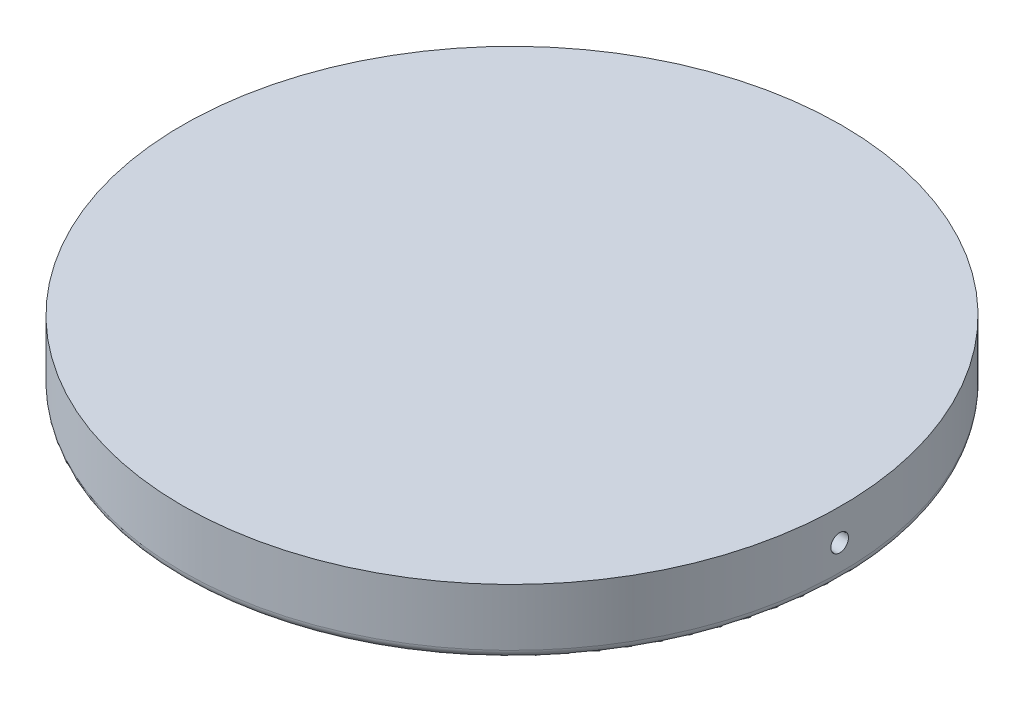
ISO-10303-21;
HEADER;
FILE_DESCRIPTION(('STEP AP214'),'2;1');
FILE_NAME('part.step','',(''),(''),'','','');
FILE_SCHEMA(('AUTOMOTIVE_DESIGN { 1 0 10303 214 1 1 1 1 }'));
ENDSEC;
DATA;
#1=APPLICATION_CONTEXT('core data for automotive mechanical design processes');
#2=APPLICATION_PROTOCOL_DEFINITION('international standard','automotive_design',2000,#1);
#3=PRODUCT_CONTEXT('',#1,'mechanical');
#4=PRODUCT('Part','Part','',(#3));
#5=PRODUCT_RELATED_PRODUCT_CATEGORY('part','',(#4));
#6=PRODUCT_DEFINITION_FORMATION('','',#4);
#7=PRODUCT_DEFINITION_CONTEXT('part definition',#1,'design');
#8=PRODUCT_DEFINITION('design','',#6,#7);
#9=PRODUCT_DEFINITION_SHAPE('','',#8);
#10=(LENGTH_UNIT() NAMED_UNIT(*) SI_UNIT(.MILLI.,.METRE.));
#11=(NAMED_UNIT(*) PLANE_ANGLE_UNIT() SI_UNIT($,.RADIAN.));
#12=(NAMED_UNIT(*) SI_UNIT($,.STERADIAN.) SOLID_ANGLE_UNIT());
#13=UNCERTAINTY_MEASURE_WITH_UNIT(LENGTH_MEASURE(1.E-05),#10,'distance_accuracy_value','');
#14=(GEOMETRIC_REPRESENTATION_CONTEXT(3) GLOBAL_UNCERTAINTY_ASSIGNED_CONTEXT((#13)) GLOBAL_UNIT_ASSIGNED_CONTEXT((#10,
#11,#12)) REPRESENTATION_CONTEXT('',''));
#15=CARTESIAN_POINT('',(0.,0.,0.));
#16=DIRECTION('',(0.,0.,1.));
#17=DIRECTION('',(1.,0.,0.));
#18=AXIS2_PLACEMENT_3D('',#15,#16,#17);
#19=CARTESIAN_POINT('',(0.,15.,0.));
#20=DIRECTION('',(0.,-1.,0.));
#21=DIRECTION('',(0.,0.,-1.));
#22=AXIS2_PLACEMENT_3D('',#19,#20,#21);
#23=CYLINDRICAL_SURFACE('',#22,75.);
#24=CARTESIAN_POINT('',(0.,2.,0.));
#25=DIRECTION('',(0.,1.,0.));
#26=DIRECTION('',(0.,0.,1.));
#27=AXIS2_PLACEMENT_3D('',#24,#25,#26);
#28=CIRCLE('',#27,75.);
#29=CARTESIAN_POINT('',(0.,2.,75.));
#30=VERTEX_POINT('',#29);
#31=EDGE_CURVE('E66',#30,#30,#28,.T.);
#32=ORIENTED_EDGE('',*,*,#31,.T.);
#33=EDGE_LOOP('',(#32));
#34=FACE_BOUND('',#33,.T.);
#35=CARTESIAN_POINT('',(0.,15.,0.));
#36=DIRECTION('',(0.,1.,0.));
#37=DIRECTION('',(0.,0.,1.));
#38=AXIS2_PLACEMENT_3D('',#35,#36,#37);
#39=CIRCLE('',#38,75.);
#40=CARTESIAN_POINT('',(0.,15.,75.));
#41=VERTEX_POINT('',#40);
#42=EDGE_CURVE('E70',#41,#41,#39,.T.);
#43=ORIENTED_EDGE('',*,*,#42,.F.);
#44=EDGE_LOOP('',(#43));
#45=FACE_BOUND('',#44,.T.);
#46=CARTESIAN_POINT('',(74.9831143951382,7.90789250676341,-1.59140051703598));
#47=CARTESIAN_POINT('',(74.9831147576543,7.79521916518556,-1.59139466791111));
#48=CARTESIAN_POINT('',(74.983328482943,7.68247068537999,-1.58140564600523));
#49=CARTESIAN_POINT('',(74.9841360050816,7.46009194389446,-1.54262939724804));
#50=CARTESIAN_POINT('',(74.9847306369029,7.35046908655241,-1.51380087018871));
#51=CARTESIAN_POINT('',(74.9862127342194,7.13765347230673,-1.43851083163473));
#52=CARTESIAN_POINT('',(74.9870997526245,7.03445118232228,-1.39207622550786));
#53=CARTESIAN_POINT('',(74.9890493096721,6.83722921802696,-1.28275320415097));
#54=CARTESIAN_POINT('',(74.9901116483274,6.7431992730925,-1.21988348921332));
#55=CARTESIAN_POINT('',(74.9917346259016,6.61082997971371,-1.11399975302977));
#56=CARTESIAN_POINT('',(74.9922835055482,6.5679499525103,-1.07654648616189));
#57=CARTESIAN_POINT('',(74.9933698584418,6.48565496548844,-0.998010088676955));
#58=CARTESIAN_POINT('',(74.9939073318845,6.44623994618797,-0.956927020395126));
#59=CARTESIAN_POINT('',(74.9954698181209,6.33359347224185,-0.828718436419516));
#60=CARTESIAN_POINT('',(74.9964454288939,6.26591982700484,-0.736600827543206));
#61=CARTESIAN_POINT('',(74.9980774957948,6.14880930626225,-0.545233552146375));
#62=CARTESIAN_POINT('',(74.9987424164279,6.09889886971792,-0.446269589959552));
#63=CARTESIAN_POINT('',(74.9996807778869,6.0156717181506,-0.241508875695325));
#64=CARTESIAN_POINT('',(74.9999542116772,5.98235530135209,-0.135712000856748));
#65=CARTESIAN_POINT('',(75.0000158065511,5.94523967379934,0.0278539429988439));
#66=CARTESIAN_POINT('',(74.9999742127198,5.93495184788642,0.0842251192138417));
#67=CARTESIAN_POINT('',(74.999760926659,5.91927475136253,0.197658043338545));
#68=CARTESIAN_POINT('',(74.999589242232,5.91388518700572,0.254719749629584));
#69=CARTESIAN_POINT('',(74.9991137135043,5.90816539050011,0.369068351974056));
#70=CARTESIAN_POINT('',(74.9988099338241,5.90783268740357,0.426355124363829));
#71=CARTESIAN_POINT('',(74.9980725555395,5.91232099065492,0.540724744146702));
#72=CARTESIAN_POINT('',(74.9976389568968,5.91714199851766,0.597807591479856));
#73=CARTESIAN_POINT('',(74.99666777867,5.93142710389621,0.709078807585716));
#74=CARTESIAN_POINT('',(74.9961350148963,5.94069911350285,0.763292067609994));
#75=CARTESIAN_POINT('',(74.9949642112914,5.96363301307494,0.870768188352102));
#76=CARTESIAN_POINT('',(74.9943261708259,5.97729492949399,0.924031043340743));
#77=CARTESIAN_POINT('',(74.9922685965265,6.02465904967286,1.08199146030498));
#78=CARTESIAN_POINT('',(74.9907057949738,6.06473689664067,1.18484024951517));
#79=CARTESIAN_POINT('',(74.9872454913968,6.16279166318149,1.38695776994992));
#80=CARTESIAN_POINT('',(74.9853368115797,6.22144089637036,1.48590202147196));
#81=CARTESIAN_POINT('',(74.9823955672594,6.32134354121091,1.62558952143614));
#82=CARTESIAN_POINT('',(74.9814022307797,6.35662793201931,1.67069264188256));
#83=CARTESIAN_POINT('',(74.9794153082377,6.43106293474174,1.75760183706779));
#84=CARTESIAN_POINT('',(74.9784217222198,6.47021308200043,1.79940830697281));
#85=CARTESIAN_POINT('',(74.9764843922621,6.55110611864288,1.87838082824168));
#86=CARTESIAN_POINT('',(74.9755400240782,6.59276346258194,1.91563462019306));
#87=CARTESIAN_POINT('',(74.9736964450613,6.6790723142962,1.98647792600494));
#88=CARTESIAN_POINT('',(74.9727972387116,6.72372411832004,2.02006707644819));
#89=CARTESIAN_POINT('',(74.9701961990559,6.86174612540728,2.11511599510396));
#90=CARTESIAN_POINT('',(74.9685913947912,6.95916459555522,2.17083948159847));
#91=CARTESIAN_POINT('',(74.9657824049821,7.16213110729992,2.26577559714169));
#92=CARTESIAN_POINT('',(74.9645798390776,7.26770995711312,2.30492164027878));
#93=CARTESIAN_POINT('',(74.962701936352,7.48388455409536,2.36521533862953));
#94=CARTESIAN_POINT('',(74.9620261175727,7.59447561694823,2.38637944838652));
#95=CARTESIAN_POINT('',(74.9614646972175,7.76247420587601,2.40391963993));
#96=CARTESIAN_POINT('',(74.9613537626695,7.81921631475054,2.40737271428294));
#97=CARTESIAN_POINT('',(74.9612925899244,7.9327846811812,2.40927660297843));
#98=CARTESIAN_POINT('',(74.9613423501533,7.98961093790766,2.40772746631678));
#99=CARTESIAN_POINT('',(74.9617298577958,8.15959118774304,2.39565377643201));
#100=CARTESIAN_POINT('',(74.9623056707446,8.27229570597341,2.3777079770352));
#101=CARTESIAN_POINT('',(74.9639912809839,8.48996794216443,2.32393898563499));
#102=CARTESIAN_POINT('',(74.9650859881375,8.59506310774587,2.28861999657931));
#103=CARTESIAN_POINT('',(74.9676947660443,8.79817239115623,2.20150865619064));
#104=CARTESIAN_POINT('',(74.9692088087083,8.89618698272447,2.14971740822055));
#105=CARTESIAN_POINT('',(74.9725853196906,9.08587047090947,2.02860488724229));
#106=CARTESIAN_POINT('',(74.9744583796202,9.17718330816714,1.95871905019558));
#107=CARTESIAN_POINT('',(74.977368186527,9.30377667508201,1.84275616601305));
#108=CARTESIAN_POINT('',(74.9783551163882,9.34425506306357,1.8022332316165));
#109=CARTESIAN_POINT('',(74.9803379140477,9.42146802076021,1.71776458196401));
#110=CARTESIAN_POINT('',(74.9813337821145,9.45820247758682,1.67381876357037));
#111=CARTESIAN_POINT('',(74.9842234660465,9.55999259097211,1.5407395596234));
#112=CARTESIAN_POINT('',(74.9860941996191,9.61974753419125,1.44746979816985));
#113=CARTESIAN_POINT('',(74.9896047509125,9.72339462416106,1.25247914933051));
#114=CARTESIAN_POINT('',(74.9912443876386,9.76727437915837,1.1507517359644));
#115=CARTESIAN_POINT('',(74.9942106311693,9.83919930992078,0.938098032729597));
#116=CARTESIAN_POINT('',(74.9955252989283,9.86668201295023,0.826980021895059));
#117=CARTESIAN_POINT('',(74.9976702921944,9.90223378563753,0.601752425975222));
#118=CARTESIAN_POINT('',(74.9985011249548,9.9103232150672,0.487646105509598));
#119=CARTESIAN_POINT('',(74.9996254092866,9.90628691578862,0.262047774392684));
#120=CARTESIAN_POINT('',(74.9999291063343,9.89455555710124,0.150548476561483));
#121=CARTESIAN_POINT('',(75.0000487449079,9.8527149445081,-0.0690336709074058));
#122=CARTESIAN_POINT('',(74.999864147847,9.82258542568126,-0.177112614880283));
#123=CARTESIAN_POINT('',(74.9990741817348,9.74497431418019,-0.387245602609833));
#124=CARTESIAN_POINT('',(74.9984673839307,9.69743406204487,-0.489277908092074));
#125=CARTESIAN_POINT('',(74.9969433245988,9.58619337722495,-0.684078985812986));
#126=CARTESIAN_POINT('',(74.9960263661833,9.52250873721445,-0.776856688152749));
#127=CARTESIAN_POINT('',(74.9945222214621,9.41541152310366,-0.907518845357272));
#128=CARTESIAN_POINT('',(74.9939946987921,9.37743706677829,-0.949955885381645));
#129=CARTESIAN_POINT('',(74.9929203438117,9.29784624228071,-1.03128514301814));
#130=CARTESIAN_POINT('',(74.9923735121635,9.25622999891544,-1.07017748201681));
#131=CARTESIAN_POINT('',(74.9912812257116,9.16970452100679,-1.14416473967788));
#132=CARTESIAN_POINT('',(74.9907357721324,9.12479301268932,-1.17925699410042));
#133=CARTESIAN_POINT('',(74.9896652441197,9.03214730597989,-1.24547206417618));
#134=CARTESIAN_POINT('',(74.9891401710155,8.98441292398737,-1.27659462122255));
#135=CARTESIAN_POINT('',(74.9876558393263,8.84080771558441,-1.36185357267257));
#136=CARTESIAN_POINT('',(74.9867481075519,8.74154419629546,-1.4103988564265));
#137=CARTESIAN_POINT('',(74.9851886679165,8.5366833272145,-1.49101110988702));
#138=CARTESIAN_POINT('',(74.9845366600505,8.43109356784401,-1.52309740231075));
#139=CARTESIAN_POINT('',(74.9837503526066,8.25538021695473,-1.56121412185315));
#140=CARTESIAN_POINT('',(74.9835139710236,8.18636108752459,-1.57247912415924));
#141=CARTESIAN_POINT('',(74.9831959111005,8.04753487681907,-1.58757263675666));
#142=CARTESIAN_POINT('',(74.9831141704485,7.97772812432422,-1.5914041423589));
#143=CARTESIAN_POINT('',(74.9831143951382,7.90789250676341,-1.59140051703598));
#144=B_SPLINE_CURVE_WITH_KNOTS('',3,(#46,#47,#48,#49,#50,#51,#52,#53,#54,#55,#56,#57,#58,#59,
#60,#61,#62,#63,#64,#65,#66,#67,#68,#69,#70,#71,#72,#73,#74,#75,#76,#77,#78,#79,#80,#81,#82,#83,
#84,#85,#86,#87,#88,#89,#90,#91,#92,#93,#94,#95,#96,#97,#98,#99,#100,#101,#102,#103,#104,#105,
#106,#107,#108,#109,#110,#111,#112,#113,#114,#115,#116,#117,#118,#119,#120,#121,#122,#123,#124,
#125,#126,#127,#128,#129,#130,#131,#132,#133,#134,#135,#136,#137,#138,#139,#140,#141,#142,#143),
.UNSPECIFIED.,.T.,.F.,(4,2,2,2,2,2,2,2,2,2,2,2,2,2,2,2,2,2,2,2,2,2,2,2,2,2,2,2,2,2,2,2,2,2,2,2,
2,2,2,2,2,2,2,2,2,2,2,2,4),(0.,0.337768211448335,0.676279377957609,1.01427530784169,
1.35188831856574,1.5225050562389,1.69311886444979,2.03419181146603,2.36533529515297,
2.69648472987121,2.86821587287864,3.03993671659131,3.21157364918581,3.38321063222999,
3.548028200412,3.71284676180441,4.04254556642816,4.38589353607552,4.55752904764824,
4.72914395406915,4.89661063029596,5.0640938988872,5.39913603253197,5.73551143658421,
6.07157870452216,6.24192959954549,6.41227882601608,6.75283140913283,7.08403679307709,
7.41521999653023,7.75834030611736,7.92999694803696,8.10165876428434,8.43239705349709,
8.76339295411558,9.10517280205719,9.44659367951273,9.78130107794364,10.1163778113822,
10.4525940149473,10.7884825875816,10.9591439714201,11.1297995088461,11.3005739286542,
11.4713594679244,11.8013474141834,12.130947065604,12.3403822518747,12.5497330291622),.UNSPECIFIED.);
#145=CARTESIAN_POINT('',(74.9831143951382,7.90789250676341,-1.59140051703598));
#146=VERTEX_POINT('',#145);
#147=EDGE_CURVE('E45',#146,#146,#144,.F.);
#148=ORIENTED_EDGE('',*,*,#147,.F.);
#149=EDGE_LOOP('',(#148));
#150=FACE_BOUND('',#149,.T.);
#151=ADVANCED_FACE('F40',(#34,#45,#150),#23,.T.);
#152=CARTESIAN_POINT('',(0.,15.,0.));
#153=DIRECTION('',(0.,1.,0.));
#154=DIRECTION('',(0.,0.,1.));
#155=AXIS2_PLACEMENT_3D('',#152,#153,#154);
#156=PLANE('',#155);
#157=ORIENTED_EDGE('',*,*,#42,.T.);
#158=EDGE_LOOP('',(#157));
#159=FACE_BOUND('',#158,.T.);
#160=ADVANCED_FACE('F130',(#159),#156,.T.);
#161=CARTESIAN_POINT('',(0.,0.,0.));
#162=DIRECTION('',(0.,1.,0.));
#163=DIRECTION('',(0.,0.,1.));
#164=AXIS2_PLACEMENT_3D('',#161,#162,#163);
#165=PLANE('',#164);
#166=CARTESIAN_POINT('',(30.,0.,0.));
#167=DIRECTION('',(0.,-1.,0.));
#168=DIRECTION('',(0.,0.,-1.));
#169=AXIS2_PLACEMENT_3D('',#166,#167,#168);
#170=CIRCLE('',#169,6.5);
#171=CARTESIAN_POINT('',(30.,0.,-6.5));
#172=VERTEX_POINT('',#171);
#173=EDGE_CURVE('E79',#172,#172,#170,.T.);
#174=ORIENTED_EDGE('',*,*,#173,.F.);
#175=EDGE_LOOP('',(#174));
#176=FACE_BOUND('',#175,.T.);
#177=CARTESIAN_POINT('',(-35.,0.,0.));
#178=DIRECTION('',(0.,1.,0.));
#179=DIRECTION('',(0.,0.,1.));
#180=AXIS2_PLACEMENT_3D('',#177,#178,#179);
#181=CIRCLE('',#180,11.);
#182=CARTESIAN_POINT('',(-35.,0.,11.));
#183=VERTEX_POINT('',#182);
#184=EDGE_CURVE('E55',#183,#183,#181,.T.);
#185=ORIENTED_EDGE('',*,*,#184,.T.);
#186=EDGE_LOOP('',(#185));
#187=FACE_BOUND('',#186,.T.);
#188=CARTESIAN_POINT('',(0.,0.,0.));
#189=DIRECTION('',(0.,1.,0.));
#190=DIRECTION('',(0.,0.,1.));
#191=AXIS2_PLACEMENT_3D('',#188,#189,#190);
#192=CIRCLE('',#191,73.);
#193=CARTESIAN_POINT('',(0.,0.,73.));
#194=VERTEX_POINT('',#193);
#195=EDGE_CURVE('E60',#194,#194,#192,.F.);
#196=ORIENTED_EDGE('',*,*,#195,.T.);
#197=EDGE_LOOP('',(#196));
#198=FACE_BOUND('',#197,.T.);
#199=ADVANCED_FACE('F125',(#176,#187,#198),#165,.F.);
#200=CARTESIAN_POINT('',(-35.,43.2842712474619,0.));
#201=DIRECTION('',(0.,-1.,0.));
#202=DIRECTION('',(0.,0.,-1.));
#203=AXIS2_PLACEMENT_3D('',#200,#201,#202);
#204=CYLINDRICAL_SURFACE('',#203,10.);
#205=CARTESIAN_POINT('',(-35.,0.999999999999973,0.));
#206=DIRECTION('',(0.,1.,0.));
#207=DIRECTION('',(0.,0.,1.));
#208=AXIS2_PLACEMENT_3D('',#205,#206,#207);
#209=CIRCLE('',#208,10.);
#210=CARTESIAN_POINT('',(-35.,0.999999999999973,10.));
#211=VERTEX_POINT('',#210);
#212=EDGE_CURVE('E11',#211,#211,#209,.F.);
#213=ORIENTED_EDGE('',*,*,#212,.T.);
#214=EDGE_LOOP('',(#213));
#215=FACE_BOUND('',#214,.T.);
#216=CARTESIAN_POINT('',(-35.,10.,0.));
#217=DIRECTION('',(0.,1.,0.));
#218=DIRECTION('',(0.,0.,1.));
#219=AXIS2_PLACEMENT_3D('',#216,#217,#218);
#220=CIRCLE('',#219,10.);
#221=CARTESIAN_POINT('',(-35.,10.,10.));
#222=VERTEX_POINT('',#221);
#223=EDGE_CURVE('E74',#222,#222,#220,.T.);
#224=ORIENTED_EDGE('',*,*,#223,.T.);
#225=EDGE_LOOP('',(#224));
#226=FACE_BOUND('',#225,.T.);
#227=ADVANCED_FACE('F121',(#215,#226),#204,.F.);
#228=CARTESIAN_POINT('',(0.,10.,0.));
#229=DIRECTION('',(0.,1.,0.));
#230=DIRECTION('',(0.,0.,1.));
#231=AXIS2_PLACEMENT_3D('',#228,#229,#230);
#232=PLANE('',#231);
#233=ORIENTED_EDGE('',*,*,#223,.F.);
#234=EDGE_LOOP('',(#233));
#235=FACE_BOUND('',#234,.T.);
#236=ADVANCED_FACE('F124',(#235),#232,.F.);
#237=CARTESIAN_POINT('',(0.,2.,0.));
#238=DIRECTION('',(0.,1.,0.));
#239=DIRECTION('',(0.,0.,1.));
#240=AXIS2_PLACEMENT_3D('',#237,#238,#239);
#241=TOROIDAL_SURFACE('',#240,73.,2.);
#242=ORIENTED_EDGE('',*,*,#195,.F.);
#243=EDGE_LOOP('',(#242));
#244=FACE_BOUND('',#243,.T.);
#245=ORIENTED_EDGE('',*,*,#31,.F.);
#246=EDGE_LOOP('',(#245));
#247=FACE_BOUND('',#246,.T.);
#248=ADVANCED_FACE('F128',(#244,#247),#241,.T.);
#249=CARTESIAN_POINT('',(-35.,0.,0.));
#250=DIRECTION('',(0.,-1.,0.));
#251=DIRECTION('',(0.,0.,-1.));
#252=AXIS2_PLACEMENT_3D('',#249,#250,#251);
#253=CONICAL_SURFACE('',#252,11.,0.785398163397453);
#254=ORIENTED_EDGE('',*,*,#212,.F.);
#255=EDGE_LOOP('',(#254));
#256=FACE_BOUND('',#255,.T.);
#257=ORIENTED_EDGE('',*,*,#184,.F.);
#258=EDGE_LOOP('',(#257));
#259=FACE_BOUND('',#258,.T.);
#260=ADVANCED_FACE('F43',(#256,#259),#253,.F.);
#261=CARTESIAN_POINT('',(30.,2.,0.));
#262=DIRECTION('',(0.,-1.,0.));
#263=DIRECTION('',(0.,0.,-1.));
#264=AXIS2_PLACEMENT_3D('',#261,#262,#263);
#265=CYLINDRICAL_SURFACE('',#264,6.5);
#266=CARTESIAN_POINT('',(30.,2.,0.));
#267=DIRECTION('',(0.,-1.,0.));
#268=DIRECTION('',(0.,0.,-1.));
#269=AXIS2_PLACEMENT_3D('',#266,#267,#268);
#270=CIRCLE('',#269,6.5);
#271=CARTESIAN_POINT('',(30.,2.,-6.5));
#272=VERTEX_POINT('',#271);
#273=EDGE_CURVE('E78',#272,#272,#270,.T.);
#274=ORIENTED_EDGE('',*,*,#273,.F.);
#275=EDGE_LOOP('',(#274));
#276=FACE_BOUND('',#275,.T.);
#277=ORIENTED_EDGE('',*,*,#173,.T.);
#278=EDGE_LOOP('',(#277));
#279=FACE_BOUND('',#278,.T.);
#280=ADVANCED_FACE('F116',(#276,#279),#265,.F.);
#281=CARTESIAN_POINT('',(30.,2.,0.));
#282=DIRECTION('',(0.,-1.,0.));
#283=DIRECTION('',(0.,0.,-1.));
#284=AXIS2_PLACEMENT_3D('',#281,#282,#283);
#285=PLANE('',#284);
#286=ORIENTED_EDGE('',*,*,#273,.T.);
#287=EDGE_LOOP('',(#286));
#288=FACE_BOUND('',#287,.T.);
#289=ADVANCED_FACE('F112',(#288),#285,.T.);
#290=CARTESIAN_POINT('',(-5.,15.,0.));
#291=DIRECTION('',(0.,-1.,0.));
#292=DIRECTION('',(0.,0.,-1.));
#293=AXIS2_PLACEMENT_3D('',#290,#291,#292);
#294=CYLINDRICAL_SURFACE('',#293,75.);
#295=CARTESIAN_POINT('',(69.9613143503526,7.90859935805437,2.40859935805433));
#296=CARTESIAN_POINT('',(69.9613143503526,8.43714816329377,2.40859935805433));
#297=CARTESIAN_POINT('',(69.9688941003957,8.95495758431157,2.19124595225103));
#298=CARTESIAN_POINT('',(69.9868512715752,9.6928832522801,1.45216315690127));
#299=CARTESIAN_POINT('',(69.9960368461705,9.90910843860998,0.934234590272285));
#300=CARTESIAN_POINT('',(70.0017581088545,9.90808840837625,-0.120902782052025));
#301=CARTESIAN_POINT('',(69.9981875517281,9.69064291597085,-0.638483077691695));
#302=CARTESIAN_POINT('',(69.9882923703736,8.95229702540964,-1.3754286822849));
#303=CARTESIAN_POINT('',(69.9831104789807,8.42998330667718,-1.59158503732546));
#304=CARTESIAN_POINT('',(69.9831183112957,7.38580170684964,-1.5912159967465));
#305=CARTESIAN_POINT('',(69.9882622997669,6.86681859339016,-1.37844131306514));
#306=CARTESIAN_POINT('',(69.998273673326,6.12045839467151,-0.631291702072487));
#307=CARTESIAN_POINT('',(70.0017312177552,5.9082971130559,-0.111986371976905));
#308=CARTESIAN_POINT('',(69.9960300637577,5.90890227571427,0.931504849074004));
#309=CARTESIAN_POINT('',(69.9868193521874,6.1253093535734,1.45367892825975));
#310=CARTESIAN_POINT('',(69.9688775059552,6.86324171243086,2.19172637004168));
#311=CARTESIAN_POINT('',(69.9613143503526,7.38005055281496,2.40859935805433));
#312=CARTESIAN_POINT('',(69.9613143503526,7.90859935805437,2.40859935805433));
#313=B_SPLINE_CURVE_WITH_KNOTS('',3,(#295,#296,#297,#298,#299,#300,#301,#302,#303,#304,#305,
#306,#307,#308,#309,#310,#311,#312),.UNSPECIFIED.,.T.,.F.,(4,2,2,2,2,2,2,2,4),(0.,0.125,0.25,
0.375,0.5,0.625,0.75,0.875,1.),.UNSPECIFIED.);
#314=CARTESIAN_POINT('',(69.9613143503526,7.90859935805437,2.40859935805433));
#315=VERTEX_POINT('',#314);
#316=EDGE_CURVE('E91',#315,#315,#313,.F.);
#317=ORIENTED_EDGE('',*,*,#316,.T.);
#318=EDGE_LOOP('',(#317));
#319=FACE_BOUND('',#318,.T.);
#320=ADVANCED_FACE('F102',(#319),#294,.T.);
#321=CARTESIAN_POINT('',(74.9613143503526,7.90859935805437,2.40859935805433));
#322=CARTESIAN_POINT('',(74.9613143503526,7.38005055281496,2.40859935805433));
#323=CARTESIAN_POINT('',(74.9688775059551,6.86324171243086,2.19172637004168));
#324=CARTESIAN_POINT('',(74.9868193521873,6.1253093535734,1.45367892825975));
#325=CARTESIAN_POINT('',(74.9960300637576,5.90890227571427,0.931504849074004));
#326=CARTESIAN_POINT('',(75.0017312177551,5.9082971130559,-0.111986371976905));
#327=CARTESIAN_POINT('',(74.9982736733259,6.12045839467151,-0.631291702072487));
#328=CARTESIAN_POINT('',(74.9882622997668,6.86681859339016,-1.37844131306514));
#329=CARTESIAN_POINT('',(74.9831183112957,7.38580170684964,-1.5912159967465));
#330=CARTESIAN_POINT('',(74.9831104789807,8.42998330667718,-1.59158503732546));
#331=CARTESIAN_POINT('',(74.9882923703736,8.95229702540964,-1.3754286822849));
#332=CARTESIAN_POINT('',(74.9981875517281,9.69064291597085,-0.638483077691695));
#333=CARTESIAN_POINT('',(75.0017581088545,9.90808840837625,-0.120902782052025));
#334=CARTESIAN_POINT('',(74.9960368461705,9.90910843860998,0.934234590272285));
#335=CARTESIAN_POINT('',(74.9868512715752,9.6928832522801,1.45216315690127));
#336=CARTESIAN_POINT('',(74.9688941003956,8.95495758431157,2.19124595225103));
#337=CARTESIAN_POINT('',(74.9613143503526,8.43714816329377,2.40859935805433));
#338=CARTESIAN_POINT('',(74.9613143503526,7.90859935805437,2.40859935805433));
#339=B_SPLINE_CURVE_WITH_KNOTS('',3,(#321,#322,#323,#324,#325,#326,#327,#328,#329,#330,#331,
#332,#333,#334,#335,#336,#337,#338),.UNSPECIFIED.,.T.,.F.,(4,2,2,2,2,2,2,2,4),(0.,0.125,0.25,
0.375,0.5,0.625,0.75,0.875,1.),.UNSPECIFIED.);
#340=DIRECTION('',(-1.,0.,0.));
#341=VECTOR('',#340,1.);
#342=SURFACE_OF_LINEAR_EXTRUSION('',#339,#341);
#343=ORIENTED_EDGE('',*,*,#316,.F.);
#344=EDGE_LOOP('',(#343));
#345=FACE_BOUND('',#344,.T.);
#346=ORIENTED_EDGE('',*,*,#147,.T.);
#347=EDGE_LOOP('',(#346));
#348=FACE_BOUND('',#347,.T.);
#349=ADVANCED_FACE('F111',(#345,#348),#342,.T.);
#350=CLOSED_SHELL('',(#151,#160,#199,#227,#236,#248,#260,#280,#289,#320,#349));
#351=MANIFOLD_SOLID_BREP('B2',#350);
#352=ADVANCED_BREP_SHAPE_REPRESENTATION('',(#18,#351),#14);
#353=SHAPE_DEFINITION_REPRESENTATION(#9,#352);
ENDSEC;
END-ISO-10303-21;
